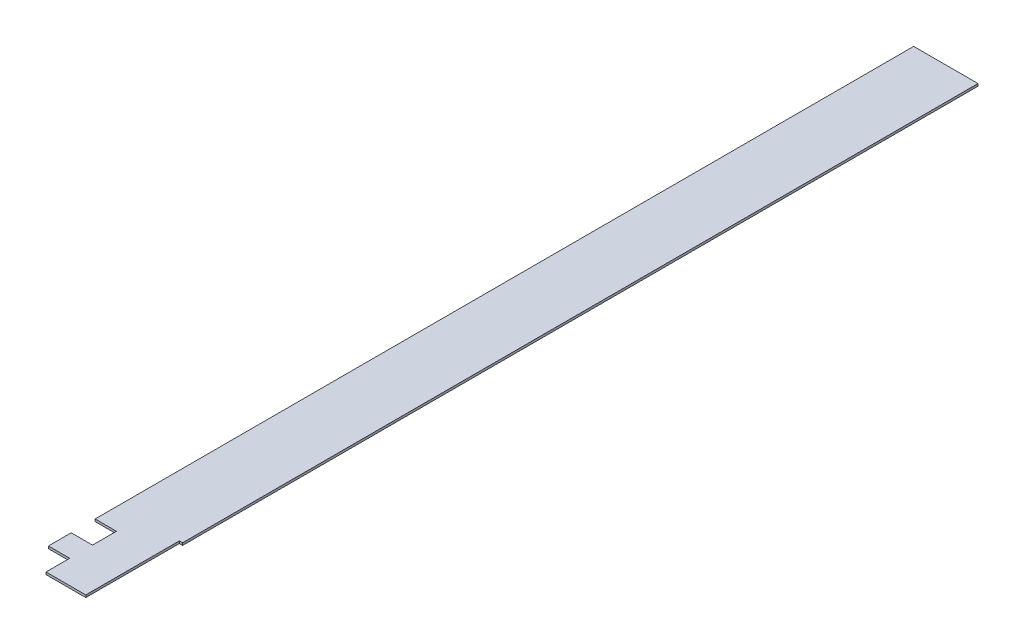
ISO-10303-21;
HEADER;
FILE_DESCRIPTION(('STEP AP214'),'2;1');
FILE_NAME('part.step','',(''),(''),'','','');
FILE_SCHEMA(('AUTOMOTIVE_DESIGN { 1 0 10303 214 1 1 1 1 }'));
ENDSEC;
DATA;
#1=APPLICATION_CONTEXT('core data for automotive mechanical design processes');
#2=APPLICATION_PROTOCOL_DEFINITION('international standard','automotive_design',2000,#1);
#3=PRODUCT_CONTEXT('',#1,'mechanical');
#4=PRODUCT('Part','Part','',(#3));
#5=PRODUCT_RELATED_PRODUCT_CATEGORY('part','',(#4));
#6=PRODUCT_DEFINITION_FORMATION('','',#4);
#7=PRODUCT_DEFINITION_CONTEXT('part definition',#1,'design');
#8=PRODUCT_DEFINITION('design','',#6,#7);
#9=PRODUCT_DEFINITION_SHAPE('','',#8);
#10=(LENGTH_UNIT() NAMED_UNIT(*) SI_UNIT(.MILLI.,.METRE.));
#11=(NAMED_UNIT(*) PLANE_ANGLE_UNIT() SI_UNIT($,.RADIAN.));
#12=(NAMED_UNIT(*) SI_UNIT($,.STERADIAN.) SOLID_ANGLE_UNIT());
#13=UNCERTAINTY_MEASURE_WITH_UNIT(LENGTH_MEASURE(1.E-05),#10,'distance_accuracy_value','');
#14=(GEOMETRIC_REPRESENTATION_CONTEXT(3) GLOBAL_UNCERTAINTY_ASSIGNED_CONTEXT((#13)) GLOBAL_UNIT_ASSIGNED_CONTEXT((#10,
#11,#12)) REPRESENTATION_CONTEXT('',''));
#15=CARTESIAN_POINT('',(0.,0.,0.));
#16=DIRECTION('',(0.,0.,1.));
#17=DIRECTION('',(1.,0.,0.));
#18=AXIS2_PLACEMENT_3D('',#15,#16,#17);
#19=CARTESIAN_POINT('',(-9.28,-0.999999999999997,139.75));
#20=DIRECTION('',(1.,0.,0.));
#21=DIRECTION('',(0.,1.,0.));
#22=AXIS2_PLACEMENT_3D('',#19,#20,#21);
#23=PLANE('',#22);
#24=DIRECTION('',(0.,0.,-1.));
#25=VECTOR('',#24,1.);
#26=CARTESIAN_POINT('',(-9.28,1.,139.75));
#27=LINE('',#26,#25);
#28=CARTESIAN_POINT('',(-9.28,1.,160.));
#29=VERTEX_POINT('',#28);
#30=CARTESIAN_POINT('',(-9.28,1.,139.75));
#31=VERTEX_POINT('',#30);
#32=EDGE_CURVE('E61',#29,#31,#27,.T.);
#33=ORIENTED_EDGE('',*,*,#32,.T.);
#34=DIRECTION('',(0.,1.,0.));
#35=VECTOR('',#34,1.);
#36=CARTESIAN_POINT('',(-9.28,-0.999999999999997,139.75));
#37=LINE('',#36,#35);
#38=CARTESIAN_POINT('',(-9.28,-0.999999999999997,139.75));
#39=VERTEX_POINT('',#38);
#40=EDGE_CURVE('E126',#39,#31,#37,.T.);
#41=ORIENTED_EDGE('',*,*,#40,.F.);
#42=DIRECTION('',(0.,0.,-1.));
#43=VECTOR('',#42,1.);
#44=CARTESIAN_POINT('',(-9.28,-0.999999999999997,139.75));
#45=LINE('',#44,#43);
#46=CARTESIAN_POINT('',(-9.28,-0.999999999999997,160.));
#47=VERTEX_POINT('',#46);
#48=EDGE_CURVE('E200',#47,#39,#45,.T.);
#49=ORIENTED_EDGE('',*,*,#48,.F.);
#50=DIRECTION('',(0.,1.,0.));
#51=VECTOR('',#50,1.);
#52=CARTESIAN_POINT('',(-9.28,-0.999999999999997,160.));
#53=LINE('',#52,#51);
#54=EDGE_CURVE('E133',#47,#29,#53,.T.);
#55=ORIENTED_EDGE('',*,*,#54,.T.);
#56=EDGE_LOOP('',(#33,#41,#49,#55));
#57=FACE_BOUND('',#56,.T.);
#58=ADVANCED_FACE('F57',(#57),#23,.F.);
#59=CARTESIAN_POINT('',(-27.5,-1.,139.75));
#60=DIRECTION('',(0.,0.,-1.));
#61=DIRECTION('',(-1.,0.,0.));
#62=AXIS2_PLACEMENT_3D('',#59,#60,#61);
#63=PLANE('',#62);
#64=DIRECTION('',(-1.,0.,0.));
#65=VECTOR('',#64,1.);
#66=CARTESIAN_POINT('',(-27.5,1.,139.75));
#67=LINE('',#66,#65);
#68=CARTESIAN_POINT('',(-27.5,1.,139.75));
#69=VERTEX_POINT('',#68);
#70=EDGE_CURVE('E232',#31,#69,#67,.T.);
#71=ORIENTED_EDGE('',*,*,#70,.T.);
#72=DIRECTION('',(0.,1.,0.));
#73=VECTOR('',#72,1.);
#74=CARTESIAN_POINT('',(-27.5,-1.,139.75));
#75=LINE('',#74,#73);
#76=CARTESIAN_POINT('',(-27.5,-1.,139.75));
#77=VERTEX_POINT('',#76);
#78=EDGE_CURVE('E228',#77,#69,#75,.T.);
#79=ORIENTED_EDGE('',*,*,#78,.F.);
#80=DIRECTION('',(-1.,0.,0.));
#81=VECTOR('',#80,1.);
#82=CARTESIAN_POINT('',(-27.5,-1.,139.75));
#83=LINE('',#82,#81);
#84=EDGE_CURVE('E197',#39,#77,#83,.T.);
#85=ORIENTED_EDGE('',*,*,#84,.F.);
#86=ORIENTED_EDGE('',*,*,#40,.T.);
#87=EDGE_LOOP('',(#71,#79,#85,#86));
#88=FACE_BOUND('',#87,.T.);
#89=ADVANCED_FACE('F252',(#88),#63,.F.);
#90=CARTESIAN_POINT('',(-27.5,-1.,560.));
#91=DIRECTION('',(-1.,0.,0.));
#92=DIRECTION('',(0.,0.,1.));
#93=AXIS2_PLACEMENT_3D('',#90,#91,#92);
#94=PLANE('',#93);
#95=ORIENTED_EDGE('',*,*,#78,.T.);
#96=DIRECTION('',(0.,0.,-1.));
#97=VECTOR('',#96,1.);
#98=CARTESIAN_POINT('',(-27.5,1.,560.));
#99=LINE('',#98,#97);
#100=CARTESIAN_POINT('',(-27.5,1.,120.25));
#101=VERTEX_POINT('',#100);
#102=EDGE_CURVE('E205',#69,#101,#99,.T.);
#103=ORIENTED_EDGE('',*,*,#102,.T.);
#104=DIRECTION('',(0.,1.,0.));
#105=VECTOR('',#104,1.);
#106=CARTESIAN_POINT('',(-27.5,-1.,120.25));
#107=LINE('',#106,#105);
#108=CARTESIAN_POINT('',(-27.5,-1.,120.25));
#109=VERTEX_POINT('',#108);
#110=EDGE_CURVE('E223',#109,#101,#107,.T.);
#111=ORIENTED_EDGE('',*,*,#110,.F.);
#112=DIRECTION('',(0.,0.,-1.));
#113=VECTOR('',#112,1.);
#114=CARTESIAN_POINT('',(-27.5,-1.,560.));
#115=LINE('',#114,#113);
#116=EDGE_CURVE('E187',#77,#109,#115,.T.);
#117=ORIENTED_EDGE('',*,*,#116,.F.);
#118=EDGE_LOOP('',(#95,#103,#111,#117));
#119=FACE_BOUND('',#118,.T.);
#120=ADVANCED_FACE('F255',(#119),#94,.T.);
#121=CARTESIAN_POINT('',(-27.5,-1.,120.25));
#122=DIRECTION('',(0.,0.,1.));
#123=DIRECTION('',(1.,0.,0.));
#124=AXIS2_PLACEMENT_3D('',#121,#122,#123);
#125=PLANE('',#124);
#126=DIRECTION('',(1.,0.,0.));
#127=VECTOR('',#126,1.);
#128=CARTESIAN_POINT('',(-27.5,1.,120.25));
#129=LINE('',#128,#127);
#130=CARTESIAN_POINT('',(-9.28,1.,120.25));
#131=VERTEX_POINT('',#130);
#132=EDGE_CURVE('E225',#101,#131,#129,.T.);
#133=ORIENTED_EDGE('',*,*,#132,.T.);
#134=DIRECTION('',(0.,1.,0.));
#135=VECTOR('',#134,1.);
#136=CARTESIAN_POINT('',(-9.28,-0.999999999999997,120.25));
#137=LINE('',#136,#135);
#138=CARTESIAN_POINT('',(-9.28,-0.999999999999997,120.25));
#139=VERTEX_POINT('',#138);
#140=EDGE_CURVE('E218',#139,#131,#137,.T.);
#141=ORIENTED_EDGE('',*,*,#140,.F.);
#142=DIRECTION('',(1.,0.,0.));
#143=VECTOR('',#142,1.);
#144=CARTESIAN_POINT('',(-27.5,-1.,120.25));
#145=LINE('',#144,#143);
#146=EDGE_CURVE('E194',#109,#139,#145,.T.);
#147=ORIENTED_EDGE('',*,*,#146,.F.);
#148=ORIENTED_EDGE('',*,*,#110,.T.);
#149=EDGE_LOOP('',(#133,#141,#147,#148));
#150=FACE_BOUND('',#149,.T.);
#151=ADVANCED_FACE('F269',(#150),#125,.F.);
#152=CARTESIAN_POINT('',(-9.28000000000001,-0.999999999999997,99.75));
#153=DIRECTION('',(1.,0.,0.));
#154=DIRECTION('',(0.,1.,0.));
#155=AXIS2_PLACEMENT_3D('',#152,#153,#154);
#156=PLANE('',#155);
#157=DIRECTION('',(0.,0.,-1.));
#158=VECTOR('',#157,1.);
#159=CARTESIAN_POINT('',(-9.28000000000001,1.,99.75));
#160=LINE('',#159,#158);
#161=CARTESIAN_POINT('',(-9.28000000000001,1.,99.75));
#162=VERTEX_POINT('',#161);
#163=EDGE_CURVE('E220',#131,#162,#160,.T.);
#164=ORIENTED_EDGE('',*,*,#163,.T.);
#165=DIRECTION('',(0.,1.,0.));
#166=VECTOR('',#165,1.);
#167=CARTESIAN_POINT('',(-9.28000000000001,-0.999999999999997,99.75));
#168=LINE('',#167,#166);
#169=CARTESIAN_POINT('',(-9.28000000000001,-0.999999999999997,99.75));
#170=VERTEX_POINT('',#169);
#171=EDGE_CURVE('E214',#170,#162,#168,.T.);
#172=ORIENTED_EDGE('',*,*,#171,.F.);
#173=DIRECTION('',(0.,0.,-1.));
#174=VECTOR('',#173,1.);
#175=CARTESIAN_POINT('',(-9.28000000000001,-0.999999999999997,99.75));
#176=LINE('',#175,#174);
#177=EDGE_CURVE('E191',#139,#170,#176,.T.);
#178=ORIENTED_EDGE('',*,*,#177,.F.);
#179=ORIENTED_EDGE('',*,*,#140,.T.);
#180=EDGE_LOOP('',(#164,#172,#178,#179));
#181=FACE_BOUND('',#180,.T.);
#182=ADVANCED_FACE('F272',(#181),#156,.F.);
#183=CARTESIAN_POINT('',(-27.5,-1.,99.75));
#184=DIRECTION('',(0.,0.,-1.));
#185=DIRECTION('',(-1.,0.,0.));
#186=AXIS2_PLACEMENT_3D('',#183,#184,#185);
#187=PLANE('',#186);
#188=DIRECTION('',(-1.,0.,0.));
#189=VECTOR('',#188,1.);
#190=CARTESIAN_POINT('',(-27.5,1.,99.75));
#191=LINE('',#190,#189);
#192=CARTESIAN_POINT('',(-27.5,1.,99.75));
#193=VERTEX_POINT('',#192);
#194=EDGE_CURVE('E216',#162,#193,#191,.T.);
#195=ORIENTED_EDGE('',*,*,#194,.T.);
#196=DIRECTION('',(0.,1.,0.));
#197=VECTOR('',#196,1.);
#198=CARTESIAN_POINT('',(-27.5,-1.,99.75));
#199=LINE('',#198,#197);
#200=CARTESIAN_POINT('',(-27.5,-1.,99.75));
#201=VERTEX_POINT('',#200);
#202=EDGE_CURVE('E204',#201,#193,#199,.T.);
#203=ORIENTED_EDGE('',*,*,#202,.F.);
#204=DIRECTION('',(-1.,0.,0.));
#205=VECTOR('',#204,1.);
#206=CARTESIAN_POINT('',(-27.5,-1.,99.75));
#207=LINE('',#206,#205);
#208=EDGE_CURVE('E185',#170,#201,#207,.T.);
#209=ORIENTED_EDGE('',*,*,#208,.F.);
#210=ORIENTED_EDGE('',*,*,#171,.T.);
#211=EDGE_LOOP('',(#195,#203,#209,#210));
#212=FACE_BOUND('',#211,.T.);
#213=ADVANCED_FACE('F276',(#212),#187,.F.);
#214=ORIENTED_EDGE('',*,*,#202,.T.);
#215=CARTESIAN_POINT('',(-27.5,1.,-600.));
#216=VERTEX_POINT('',#215);
#217=EDGE_CURVE('E149',#193,#216,#99,.T.);
#218=ORIENTED_EDGE('',*,*,#217,.T.);
#219=DIRECTION('',(0.,1.,0.));
#220=VECTOR('',#219,1.);
#221=CARTESIAN_POINT('',(-27.5,-1.,-600.));
#222=LINE('',#221,#220);
#223=CARTESIAN_POINT('',(-27.5,-1.,-600.));
#224=VERTEX_POINT('',#223);
#225=EDGE_CURVE('E236',#224,#216,#222,.T.);
#226=ORIENTED_EDGE('',*,*,#225,.F.);
#227=EDGE_CURVE('E183',#201,#224,#115,.T.);
#228=ORIENTED_EDGE('',*,*,#227,.F.);
#229=EDGE_LOOP('',(#214,#218,#226,#228));
#230=FACE_BOUND('',#229,.T.);
#231=ADVANCED_FACE('F280',(#230),#94,.T.);
#232=CARTESIAN_POINT('',(27.5,1.00000000000001,560.));
#233=DIRECTION('',(1.,0.,0.));
#234=DIRECTION('',(0.,0.,-1.));
#235=AXIS2_PLACEMENT_3D('',#232,#233,#234);
#236=PLANE('',#235);
#237=DIRECTION('',(0.,1.,0.));
#238=VECTOR('',#237,1.);
#239=CARTESIAN_POINT('',(27.5,-0.99999999999999,80.));
#240=LINE('',#239,#238);
#241=CARTESIAN_POINT('',(27.5,-0.99999999999999,80.));
#242=VERTEX_POINT('',#241);
#243=CARTESIAN_POINT('',(27.5,1.00000000000001,80.));
#244=VERTEX_POINT('',#243);
#245=EDGE_CURVE('E208',#242,#244,#240,.T.);
#246=ORIENTED_EDGE('',*,*,#245,.F.);
#247=DIRECTION('',(0.,0.,-1.));
#248=VECTOR('',#247,1.);
#249=CARTESIAN_POINT('',(27.5,-0.99999999999999,560.));
#250=LINE('',#249,#248);
#251=CARTESIAN_POINT('',(27.5,-0.99999999999999,-600.));
#252=VERTEX_POINT('',#251);
#253=EDGE_CURVE('E180',#242,#252,#250,.T.);
#254=ORIENTED_EDGE('',*,*,#253,.T.);
#255=DIRECTION('',(0.,-1.,0.));
#256=VECTOR('',#255,1.);
#257=CARTESIAN_POINT('',(27.5,1.00000000000001,-600.));
#258=LINE('',#257,#256);
#259=CARTESIAN_POINT('',(27.5,1.00000000000001,-600.));
#260=VERTEX_POINT('',#259);
#261=EDGE_CURVE('E176',#260,#252,#258,.T.);
#262=ORIENTED_EDGE('',*,*,#261,.F.);
#263=DIRECTION('',(0.,0.,-1.));
#264=VECTOR('',#263,1.);
#265=CARTESIAN_POINT('',(27.5,1.00000000000001,560.));
#266=LINE('',#265,#264);
#267=EDGE_CURVE('E141',#244,#260,#266,.T.);
#268=ORIENTED_EDGE('',*,*,#267,.F.);
#269=EDGE_LOOP('',(#246,#254,#262,#268));
#270=FACE_BOUND('',#269,.T.);
#271=ADVANCED_FACE('F282',(#270),#236,.T.);
#272=CARTESIAN_POINT('',(27.5,-0.99999999999999,80.));
#273=DIRECTION('',(0.,0.,-1.));
#274=DIRECTION('',(-1.,0.,0.));
#275=AXIS2_PLACEMENT_3D('',#272,#273,#274);
#276=PLANE('',#275);
#277=DIRECTION('',(-1.,0.,0.));
#278=VECTOR('',#277,1.);
#279=CARTESIAN_POINT('',(27.5,1.00000000000001,80.));
#280=LINE('',#279,#278);
#281=CARTESIAN_POINT('',(24.72,1.00000000000001,80.));
#282=VERTEX_POINT('',#281);
#283=EDGE_CURVE('E210',#244,#282,#280,.T.);
#284=ORIENTED_EDGE('',*,*,#283,.T.);
#285=DIRECTION('',(0.,1.,0.));
#286=VECTOR('',#285,1.);
#287=CARTESIAN_POINT('',(24.72,-0.99999999999999,80.));
#288=LINE('',#287,#286);
#289=CARTESIAN_POINT('',(24.72,-0.99999999999999,80.));
#290=VERTEX_POINT('',#289);
#291=EDGE_CURVE('E76',#290,#282,#288,.T.);
#292=ORIENTED_EDGE('',*,*,#291,.F.);
#293=DIRECTION('',(-1.,0.,0.));
#294=VECTOR('',#293,1.);
#295=CARTESIAN_POINT('',(27.5,-0.99999999999999,80.));
#296=LINE('',#295,#294);
#297=EDGE_CURVE('E67',#242,#290,#296,.T.);
#298=ORIENTED_EDGE('',*,*,#297,.F.);
#299=ORIENTED_EDGE('',*,*,#245,.T.);
#300=EDGE_LOOP('',(#284,#292,#298,#299));
#301=FACE_BOUND('',#300,.T.);
#302=ADVANCED_FACE('F285',(#301),#276,.F.);
#303=CARTESIAN_POINT('',(24.72,-0.99999999999999,160.));
#304=DIRECTION('',(-1.,0.,0.));
#305=DIRECTION('',(0.,-1.,0.));
#306=AXIS2_PLACEMENT_3D('',#303,#304,#305);
#307=PLANE('',#306);
#308=DIRECTION('',(0.,0.,1.));
#309=VECTOR('',#308,1.);
#310=CARTESIAN_POINT('',(24.72,1.00000000000001,160.));
#311=LINE('',#310,#309);
#312=CARTESIAN_POINT('',(24.72,1.00000000000001,160.));
#313=VERTEX_POINT('',#312);
#314=EDGE_CURVE('E175',#282,#313,#311,.T.);
#315=ORIENTED_EDGE('',*,*,#314,.T.);
#316=DIRECTION('',(0.,-1.,0.));
#317=VECTOR('',#316,1.);
#318=CARTESIAN_POINT('',(24.72,-0.99999999999999,160.));
#319=LINE('',#318,#317);
#320=CARTESIAN_POINT('',(24.72,-0.99999999999999,160.));
#321=VERTEX_POINT('',#320);
#322=EDGE_CURVE('E166',#313,#321,#319,.T.);
#323=ORIENTED_EDGE('',*,*,#322,.T.);
#324=DIRECTION('',(0.,0.,1.));
#325=VECTOR('',#324,1.);
#326=CARTESIAN_POINT('',(24.72,-0.99999999999999,160.));
#327=LINE('',#326,#325);
#328=EDGE_CURVE('E12',#290,#321,#327,.T.);
#329=ORIENTED_EDGE('',*,*,#328,.F.);
#330=ORIENTED_EDGE('',*,*,#291,.T.);
#331=EDGE_LOOP('',(#315,#323,#329,#330));
#332=FACE_BOUND('',#331,.T.);
#333=ADVANCED_FACE('F172',(#332),#307,.F.);
#334=CARTESIAN_POINT('',(-27.5,1.,560.));
#335=DIRECTION('',(0.,1.,0.));
#336=DIRECTION('',(-1.,0.,0.));
#337=AXIS2_PLACEMENT_3D('',#334,#335,#336);
#338=PLANE('',#337);
#339=DIRECTION('',(-1.,0.,0.));
#340=VECTOR('',#339,1.);
#341=CARTESIAN_POINT('',(-27.5000000000001,1.,160.));
#342=LINE('',#341,#340);
#343=EDGE_CURVE('E170',#313,#29,#342,.T.);
#344=ORIENTED_EDGE('',*,*,#343,.F.);
#345=ORIENTED_EDGE('',*,*,#314,.F.);
#346=ORIENTED_EDGE('',*,*,#283,.F.);
#347=ORIENTED_EDGE('',*,*,#267,.T.);
#348=DIRECTION('',(1.,0.,0.));
#349=VECTOR('',#348,1.);
#350=CARTESIAN_POINT('',(-27.5,1.,-600.));
#351=LINE('',#350,#349);
#352=EDGE_CURVE('E234',#216,#260,#351,.T.);
#353=ORIENTED_EDGE('',*,*,#352,.F.);
#354=ORIENTED_EDGE('',*,*,#217,.F.);
#355=ORIENTED_EDGE('',*,*,#194,.F.);
#356=ORIENTED_EDGE('',*,*,#163,.F.);
#357=ORIENTED_EDGE('',*,*,#132,.F.);
#358=ORIENTED_EDGE('',*,*,#102,.F.);
#359=ORIENTED_EDGE('',*,*,#70,.F.);
#360=ORIENTED_EDGE('',*,*,#32,.F.);
#361=EDGE_LOOP('',(#344,#345,#346,#347,#353,#354,#355,#356,#357,#358,#359,#360));
#362=FACE_BOUND('',#361,.T.);
#363=ADVANCED_FACE('F247',(#362),#338,.T.);
#364=CARTESIAN_POINT('',(-27.5,-1.,560.));
#365=DIRECTION('',(0.,1.,0.));
#366=DIRECTION('',(-1.,0.,0.));
#367=AXIS2_PLACEMENT_3D('',#364,#365,#366);
#368=PLANE('',#367);
#369=ORIENTED_EDGE('',*,*,#328,.T.);
#370=DIRECTION('',(1.,0.,0.));
#371=VECTOR('',#370,1.);
#372=CARTESIAN_POINT('',(27.5,-0.99999999999999,160.));
#373=LINE('',#372,#371);
#374=EDGE_CURVE('E163',#47,#321,#373,.T.);
#375=ORIENTED_EDGE('',*,*,#374,.F.);
#376=ORIENTED_EDGE('',*,*,#48,.T.);
#377=ORIENTED_EDGE('',*,*,#84,.T.);
#378=ORIENTED_EDGE('',*,*,#116,.T.);
#379=ORIENTED_EDGE('',*,*,#146,.T.);
#380=ORIENTED_EDGE('',*,*,#177,.T.);
#381=ORIENTED_EDGE('',*,*,#208,.T.);
#382=ORIENTED_EDGE('',*,*,#227,.T.);
#383=DIRECTION('',(-1.,0.,0.));
#384=VECTOR('',#383,1.);
#385=CARTESIAN_POINT('',(27.5,-0.99999999999999,-600.));
#386=LINE('',#385,#384);
#387=EDGE_CURVE('E241',#252,#224,#386,.T.);
#388=ORIENTED_EDGE('',*,*,#387,.F.);
#389=ORIENTED_EDGE('',*,*,#253,.F.);
#390=ORIENTED_EDGE('',*,*,#297,.T.);
#391=EDGE_LOOP('',(#369,#375,#376,#377,#378,#379,#380,#381,#382,#388,#389,#390));
#392=FACE_BOUND('',#391,.T.);
#393=ADVANCED_FACE('F59',(#392),#368,.F.);
#394=CARTESIAN_POINT('',(0.,0.,-600.));
#395=DIRECTION('',(0.,0.,-1.));
#396=DIRECTION('',(-1.,0.,0.));
#397=AXIS2_PLACEMENT_3D('',#394,#395,#396);
#398=PLANE('',#397);
#399=ORIENTED_EDGE('',*,*,#261,.T.);
#400=ORIENTED_EDGE('',*,*,#387,.T.);
#401=ORIENTED_EDGE('',*,*,#225,.T.);
#402=ORIENTED_EDGE('',*,*,#352,.T.);
#403=EDGE_LOOP('',(#399,#400,#401,#402));
#404=FACE_BOUND('',#403,.T.);
#405=ADVANCED_FACE('F293',(#404),#398,.T.);
#406=CARTESIAN_POINT('',(27.5,11.9211202345139,160.));
#407=DIRECTION('',(0.,0.,-1.));
#408=DIRECTION('',(-1.,0.,0.));
#409=AXIS2_PLACEMENT_3D('',#406,#407,#408);
#410=PLANE('',#409);
#411=ORIENTED_EDGE('',*,*,#374,.T.);
#412=ORIENTED_EDGE('',*,*,#322,.F.);
#413=ORIENTED_EDGE('',*,*,#343,.T.);
#414=ORIENTED_EDGE('',*,*,#54,.F.);
#415=EDGE_LOOP('',(#411,#412,#413,#414));
#416=FACE_BOUND('',#415,.T.);
#417=ADVANCED_FACE('F165',(#416),#410,.F.);
#418=CLOSED_SHELL('',(#58,#89,#120,#151,#182,#213,#231,#271,#302,#333,#363,#393,#405,#417));
#419=MANIFOLD_SOLID_BREP('B2',#418);
#420=ADVANCED_BREP_SHAPE_REPRESENTATION('',(#18,#419),#14);
#421=SHAPE_DEFINITION_REPRESENTATION(#9,#420);
ENDSEC;
END-ISO-10303-21;
